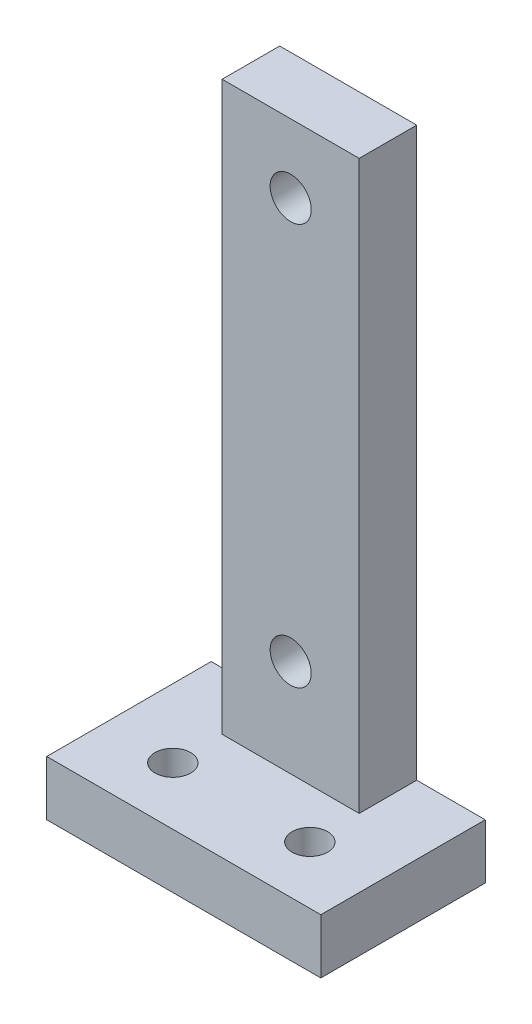
ISO-10303-21;
HEADER;
FILE_DESCRIPTION(('STEP AP214'),'2;1');
FILE_NAME('part.step','',(''),(''),'','','');
FILE_SCHEMA(('AUTOMOTIVE_DESIGN { 1 0 10303 214 1 1 1 1 }'));
ENDSEC;
DATA;
#1=APPLICATION_CONTEXT('core data for automotive mechanical design processes');
#2=APPLICATION_PROTOCOL_DEFINITION('international standard','automotive_design',2000,#1);
#3=PRODUCT_CONTEXT('',#1,'mechanical');
#4=PRODUCT('Part','Part','',(#3));
#5=PRODUCT_RELATED_PRODUCT_CATEGORY('part','',(#4));
#6=PRODUCT_DEFINITION_FORMATION('','',#4);
#7=PRODUCT_DEFINITION_CONTEXT('part definition',#1,'design');
#8=PRODUCT_DEFINITION('design','',#6,#7);
#9=PRODUCT_DEFINITION_SHAPE('','',#8);
#10=(LENGTH_UNIT() NAMED_UNIT(*) SI_UNIT(.MILLI.,.METRE.));
#11=(NAMED_UNIT(*) PLANE_ANGLE_UNIT() SI_UNIT($,.RADIAN.));
#12=(NAMED_UNIT(*) SI_UNIT($,.STERADIAN.) SOLID_ANGLE_UNIT());
#13=UNCERTAINTY_MEASURE_WITH_UNIT(LENGTH_MEASURE(1.E-05),#10,'distance_accuracy_value','');
#14=(GEOMETRIC_REPRESENTATION_CONTEXT(3) GLOBAL_UNCERTAINTY_ASSIGNED_CONTEXT((#13)) GLOBAL_UNIT_ASSIGNED_CONTEXT((#10,
#11,#12)) REPRESENTATION_CONTEXT('',''));
#15=CARTESIAN_POINT('',(0.,0.,0.));
#16=DIRECTION('',(0.,0.,1.));
#17=DIRECTION('',(1.,0.,0.));
#18=AXIS2_PLACEMENT_3D('',#15,#16,#17);
#19=CARTESIAN_POINT('',(-100.96160810836,-5.08,-61.813229454098));
#20=DIRECTION('',(-1.,0.,0.));
#21=DIRECTION('',(0.,0.,1.));
#22=AXIS2_PLACEMENT_3D('',#19,#20,#21);
#23=PLANE('',#22);
#24=DIRECTION('',(0.,0.,1.));
#25=VECTOR('',#24,1.);
#26=CARTESIAN_POINT('',(-100.96160810836,0.,-61.813229454098));
#27=LINE('',#26,#25);
#28=CARTESIAN_POINT('',(-100.96160810836,0.,-61.813229454098));
#29=VERTEX_POINT('',#28);
#30=CARTESIAN_POINT('',(-100.96160810836,0.,-46.573229454098));
#31=VERTEX_POINT('',#30);
#32=EDGE_CURVE('E134',#29,#31,#27,.T.);
#33=ORIENTED_EDGE('',*,*,#32,.F.);
#34=DIRECTION('',(0.,1.,0.));
#35=VECTOR('',#34,1.);
#36=CARTESIAN_POINT('',(-100.96160810836,-5.08,-61.813229454098));
#37=LINE('',#36,#35);
#38=CARTESIAN_POINT('',(-100.96160810836,-5.08,-61.813229454098));
#39=VERTEX_POINT('',#38);
#40=EDGE_CURVE('E11',#39,#29,#37,.T.);
#41=ORIENTED_EDGE('',*,*,#40,.F.);
#42=DIRECTION('',(0.,0.,1.));
#43=VECTOR('',#42,1.);
#44=CARTESIAN_POINT('',(-100.96160810836,-5.08,-61.813229454098));
#45=LINE('',#44,#43);
#46=CARTESIAN_POINT('',(-100.96160810836,-5.08,-46.573229454098));
#47=VERTEX_POINT('',#46);
#48=EDGE_CURVE('E137',#39,#47,#45,.T.);
#49=ORIENTED_EDGE('',*,*,#48,.T.);
#50=DIRECTION('',(0.,1.,0.));
#51=VECTOR('',#50,1.);
#52=CARTESIAN_POINT('',(-100.96160810836,-5.08,-46.573229454098));
#53=LINE('',#52,#51);
#54=EDGE_CURVE('E150',#47,#31,#53,.T.);
#55=ORIENTED_EDGE('',*,*,#54,.T.);
#56=EDGE_LOOP('',(#33,#41,#49,#55));
#57=FACE_BOUND('',#56,.T.);
#58=ADVANCED_FACE('F33',(#57),#23,.T.);
#59=CARTESIAN_POINT('',(-100.96160810836,-5.08,-61.813229454098));
#60=DIRECTION('',(0.,0.,-1.));
#61=DIRECTION('',(-1.,0.,0.));
#62=AXIS2_PLACEMENT_3D('',#59,#60,#61);
#63=PLANE('',#62);
#64=CARTESIAN_POINT('',(-88.26160810836,9.017,-61.813229454098));
#65=DIRECTION('',(0.,0.,-1.));
#66=DIRECTION('',(-1.,0.,0.));
#67=AXIS2_PLACEMENT_3D('',#64,#65,#66);
#68=CIRCLE('',#67,1.90500000000001);
#69=CARTESIAN_POINT('',(-90.16660810836,9.017,-61.813229454098));
#70=VERTEX_POINT('',#69);
#71=EDGE_CURVE('E200',#70,#70,#68,.T.);
#72=ORIENTED_EDGE('',*,*,#71,.F.);
#73=EDGE_LOOP('',(#72));
#74=FACE_BOUND('',#73,.T.);
#75=CARTESIAN_POINT('',(-88.26160810836,46.228,-61.813229454098));
#76=DIRECTION('',(0.,0.,-1.));
#77=DIRECTION('',(-1.,0.,0.));
#78=AXIS2_PLACEMENT_3D('',#75,#76,#77);
#79=CIRCLE('',#78,1.90500000000001);
#80=CARTESIAN_POINT('',(-90.16660810836,46.228,-61.813229454098));
#81=VERTEX_POINT('',#80);
#82=EDGE_CURVE('E194',#81,#81,#79,.T.);
#83=ORIENTED_EDGE('',*,*,#82,.F.);
#84=EDGE_LOOP('',(#83));
#85=FACE_BOUND('',#84,.T.);
#86=DIRECTION('',(-1.,0.,0.));
#87=VECTOR('',#86,1.);
#88=CARTESIAN_POINT('',(-100.96160810836,0.,-61.813229454098));
#89=LINE('',#88,#87);
#90=CARTESIAN_POINT('',(-75.56160810836,0.,-61.813229454098));
#91=VERTEX_POINT('',#90);
#92=CARTESIAN_POINT('',(-81.91160810836,0.,-61.813229454098));
#93=VERTEX_POINT('',#92);
#94=EDGE_CURVE('E141',#91,#93,#89,.T.);
#95=ORIENTED_EDGE('',*,*,#94,.F.);
#96=DIRECTION('',(0.,1.,0.));
#97=VECTOR('',#96,1.);
#98=CARTESIAN_POINT('',(-75.56160810836,-5.08,-61.813229454098));
#99=LINE('',#98,#97);
#100=CARTESIAN_POINT('',(-75.56160810836,-5.08,-61.813229454098));
#101=VERTEX_POINT('',#100);
#102=EDGE_CURVE('E41',#101,#91,#99,.T.);
#103=ORIENTED_EDGE('',*,*,#102,.F.);
#104=DIRECTION('',(-1.,0.,0.));
#105=VECTOR('',#104,1.);
#106=CARTESIAN_POINT('',(-100.96160810836,-5.08,-61.813229454098));
#107=LINE('',#106,#105);
#108=EDGE_CURVE('E147',#101,#39,#107,.T.);
#109=ORIENTED_EDGE('',*,*,#108,.T.);
#110=ORIENTED_EDGE('',*,*,#40,.T.);
#111=CARTESIAN_POINT('',(-94.61160810836,0.,-61.813229454098));
#112=VERTEX_POINT('',#111);
#113=EDGE_CURVE('E159',#112,#29,#89,.T.);
#114=ORIENTED_EDGE('',*,*,#113,.F.);
#115=DIRECTION('',(0.,-1.,0.));
#116=VECTOR('',#115,1.);
#117=CARTESIAN_POINT('',(-94.61160810836,52.578,-61.813229454098));
#118=LINE('',#117,#116);
#119=CARTESIAN_POINT('',(-94.61160810836,52.578,-61.813229454098));
#120=VERTEX_POINT('',#119);
#121=EDGE_CURVE('E184',#120,#112,#118,.T.);
#122=ORIENTED_EDGE('',*,*,#121,.F.);
#123=DIRECTION('',(-1.,0.,0.));
#124=VECTOR('',#123,1.);
#125=CARTESIAN_POINT('',(-94.61160810836,52.578,-61.813229454098));
#126=LINE('',#125,#124);
#127=CARTESIAN_POINT('',(-81.91160810836,52.578,-61.813229454098));
#128=VERTEX_POINT('',#127);
#129=EDGE_CURVE('E112',#128,#120,#126,.T.);
#130=ORIENTED_EDGE('',*,*,#129,.F.);
#131=DIRECTION('',(0.,-1.,0.));
#132=VECTOR('',#131,1.);
#133=CARTESIAN_POINT('',(-81.91160810836,52.578,-61.813229454098));
#134=LINE('',#133,#132);
#135=EDGE_CURVE('E124',#128,#93,#134,.T.);
#136=ORIENTED_EDGE('',*,*,#135,.T.);
#137=EDGE_LOOP('',(#95,#103,#109,#110,#114,#122,#130,#136));
#138=FACE_BOUND('',#137,.T.);
#139=ADVANCED_FACE('F181',(#74,#85,#138),#63,.T.);
#140=CARTESIAN_POINT('',(-75.56160810836,-5.08,-61.813229454098));
#141=DIRECTION('',(1.,0.,0.));
#142=DIRECTION('',(0.,0.,-1.));
#143=AXIS2_PLACEMENT_3D('',#140,#141,#142);
#144=PLANE('',#143);
#145=DIRECTION('',(0.,0.,-1.));
#146=VECTOR('',#145,1.);
#147=CARTESIAN_POINT('',(-75.56160810836,0.,-61.813229454098));
#148=LINE('',#147,#146);
#149=CARTESIAN_POINT('',(-75.56160810836,0.,-46.573229454098));
#150=VERTEX_POINT('',#149);
#151=EDGE_CURVE('E156',#150,#91,#148,.T.);
#152=ORIENTED_EDGE('',*,*,#151,.F.);
#153=DIRECTION('',(0.,1.,0.));
#154=VECTOR('',#153,1.);
#155=CARTESIAN_POINT('',(-75.56160810836,-5.08,-46.573229454098));
#156=LINE('',#155,#154);
#157=CARTESIAN_POINT('',(-75.56160810836,-5.08,-46.573229454098));
#158=VERTEX_POINT('',#157);
#159=EDGE_CURVE('E168',#158,#150,#156,.T.);
#160=ORIENTED_EDGE('',*,*,#159,.F.);
#161=DIRECTION('',(0.,0.,-1.));
#162=VECTOR('',#161,1.);
#163=CARTESIAN_POINT('',(-75.56160810836,-5.08,-61.813229454098));
#164=LINE('',#163,#162);
#165=EDGE_CURVE('E144',#158,#101,#164,.T.);
#166=ORIENTED_EDGE('',*,*,#165,.T.);
#167=ORIENTED_EDGE('',*,*,#102,.T.);
#168=EDGE_LOOP('',(#152,#160,#166,#167));
#169=FACE_BOUND('',#168,.T.);
#170=ADVANCED_FACE('F171',(#169),#144,.T.);
#171=CARTESIAN_POINT('',(-100.96160810836,-5.08,-46.573229454098));
#172=DIRECTION('',(0.,0.,1.));
#173=DIRECTION('',(1.,0.,0.));
#174=AXIS2_PLACEMENT_3D('',#171,#172,#173);
#175=PLANE('',#174);
#176=DIRECTION('',(1.,0.,0.));
#177=VECTOR('',#176,1.);
#178=CARTESIAN_POINT('',(-100.96160810836,0.,-46.573229454098));
#179=LINE('',#178,#177);
#180=EDGE_CURVE('E153',#31,#150,#179,.T.);
#181=ORIENTED_EDGE('',*,*,#180,.F.);
#182=ORIENTED_EDGE('',*,*,#54,.F.);
#183=DIRECTION('',(1.,0.,0.));
#184=VECTOR('',#183,1.);
#185=CARTESIAN_POINT('',(-100.96160810836,-5.08,-46.573229454098));
#186=LINE('',#185,#184);
#187=EDGE_CURVE('E140',#47,#158,#186,.T.);
#188=ORIENTED_EDGE('',*,*,#187,.T.);
#189=ORIENTED_EDGE('',*,*,#159,.T.);
#190=EDGE_LOOP('',(#181,#182,#188,#189));
#191=FACE_BOUND('',#190,.T.);
#192=ADVANCED_FACE('F239',(#191),#175,.T.);
#193=CARTESIAN_POINT('',(0.,-5.08,0.));
#194=DIRECTION('',(0.,1.,0.));
#195=DIRECTION('',(0.,0.,1.));
#196=AXIS2_PLACEMENT_3D('',#193,#194,#195);
#197=PLANE('',#196);
#198=CARTESIAN_POINT('',(-81.91160810836,-5.08,-51.907229454098));
#199=DIRECTION('',(0.,1.,0.));
#200=DIRECTION('',(0.,0.,1.));
#201=AXIS2_PLACEMENT_3D('',#198,#199,#200);
#202=CIRCLE('',#201,1.65100000000001);
#203=CARTESIAN_POINT('',(-81.91160810836,-5.08,-50.256229454098));
#204=VERTEX_POINT('',#203);
#205=EDGE_CURVE('E122',#204,#204,#202,.T.);
#206=ORIENTED_EDGE('',*,*,#205,.T.);
#207=EDGE_LOOP('',(#206));
#208=FACE_BOUND('',#207,.T.);
#209=CARTESIAN_POINT('',(-94.61160810836,-5.08,-51.907229454098));
#210=DIRECTION('',(0.,1.,0.));
#211=DIRECTION('',(0.,0.,1.));
#212=AXIS2_PLACEMENT_3D('',#209,#210,#211);
#213=CIRCLE('',#212,1.65100000000001);
#214=CARTESIAN_POINT('',(-94.61160810836,-5.08,-50.256229454098));
#215=VERTEX_POINT('',#214);
#216=EDGE_CURVE('E131',#215,#215,#213,.T.);
#217=ORIENTED_EDGE('',*,*,#216,.T.);
#218=EDGE_LOOP('',(#217));
#219=FACE_BOUND('',#218,.T.);
#220=ORIENTED_EDGE('',*,*,#48,.F.);
#221=ORIENTED_EDGE('',*,*,#108,.F.);
#222=ORIENTED_EDGE('',*,*,#165,.F.);
#223=ORIENTED_EDGE('',*,*,#187,.F.);
#224=EDGE_LOOP('',(#220,#221,#222,#223));
#225=FACE_BOUND('',#224,.T.);
#226=ADVANCED_FACE('F236',(#208,#219,#225),#197,.F.);
#227=CARTESIAN_POINT('',(0.,0.,0.));
#228=DIRECTION('',(0.,1.,0.));
#229=DIRECTION('',(0.,0.,1.));
#230=AXIS2_PLACEMENT_3D('',#227,#228,#229);
#231=PLANE('',#230);
#232=DIRECTION('',(0.,0.,1.));
#233=VECTOR('',#232,1.);
#234=CARTESIAN_POINT('',(-94.61160810836,0.,-61.813229454098));
#235=LINE('',#234,#233);
#236=CARTESIAN_POINT('',(-94.61160810836,0.,-56.479229454098));
#237=VERTEX_POINT('',#236);
#238=EDGE_CURVE('E54',#112,#237,#235,.T.);
#239=ORIENTED_EDGE('',*,*,#238,.F.);
#240=ORIENTED_EDGE('',*,*,#113,.T.);
#241=ORIENTED_EDGE('',*,*,#32,.T.);
#242=ORIENTED_EDGE('',*,*,#180,.T.);
#243=ORIENTED_EDGE('',*,*,#151,.T.);
#244=ORIENTED_EDGE('',*,*,#94,.T.);
#245=DIRECTION('',(0.,0.,-1.));
#246=VECTOR('',#245,1.);
#247=CARTESIAN_POINT('',(-81.91160810836,0.,-61.813229454098));
#248=LINE('',#247,#246);
#249=CARTESIAN_POINT('',(-81.91160810836,0.,-56.479229454098));
#250=VERTEX_POINT('',#249);
#251=EDGE_CURVE('E116',#250,#93,#248,.T.);
#252=ORIENTED_EDGE('',*,*,#251,.F.);
#253=DIRECTION('',(1.,0.,0.));
#254=VECTOR('',#253,1.);
#255=CARTESIAN_POINT('',(-94.61160810836,0.,-56.479229454098));
#256=LINE('',#255,#254);
#257=EDGE_CURVE('E49',#237,#250,#256,.T.);
#258=ORIENTED_EDGE('',*,*,#257,.F.);
#259=EDGE_LOOP('',(#239,#240,#241,#242,#243,#244,#252,#258));
#260=FACE_BOUND('',#259,.T.);
#261=CARTESIAN_POINT('',(-81.91160810836,0.,-51.907229454098));
#262=DIRECTION('',(0.,1.,0.));
#263=DIRECTION('',(0.,0.,1.));
#264=AXIS2_PLACEMENT_3D('',#261,#262,#263);
#265=CIRCLE('',#264,1.65100000000001);
#266=CARTESIAN_POINT('',(-81.91160810836,0.,-50.256229454098));
#267=VERTEX_POINT('',#266);
#268=EDGE_CURVE('E119',#267,#267,#265,.T.);
#269=ORIENTED_EDGE('',*,*,#268,.F.);
#270=EDGE_LOOP('',(#269));
#271=FACE_BOUND('',#270,.T.);
#272=CARTESIAN_POINT('',(-94.61160810836,0.,-51.907229454098));
#273=DIRECTION('',(0.,1.,0.));
#274=DIRECTION('',(0.,0.,1.));
#275=AXIS2_PLACEMENT_3D('',#272,#273,#274);
#276=CIRCLE('',#275,1.65100000000001);
#277=CARTESIAN_POINT('',(-94.61160810836,0.,-50.256229454098));
#278=VERTEX_POINT('',#277);
#279=EDGE_CURVE('E129',#278,#278,#276,.T.);
#280=ORIENTED_EDGE('',*,*,#279,.F.);
#281=EDGE_LOOP('',(#280));
#282=FACE_BOUND('',#281,.T.);
#283=ADVANCED_FACE('F176',(#260,#271,#282),#231,.T.);
#284=CARTESIAN_POINT('',(-94.61160810836,-5.08,-51.907229454098));
#285=DIRECTION('',(0.,1.,0.));
#286=DIRECTION('',(0.,0.,1.));
#287=AXIS2_PLACEMENT_3D('',#284,#285,#286);
#288=CYLINDRICAL_SURFACE('',#287,1.65100000000001);
#289=ORIENTED_EDGE('',*,*,#216,.F.);
#290=EDGE_LOOP('',(#289));
#291=FACE_BOUND('',#290,.T.);
#292=ORIENTED_EDGE('',*,*,#279,.T.);
#293=EDGE_LOOP('',(#292));
#294=FACE_BOUND('',#293,.T.);
#295=ADVANCED_FACE('F250',(#291,#294),#288,.F.);
#296=CARTESIAN_POINT('',(-81.91160810836,-5.08,-51.907229454098));
#297=DIRECTION('',(0.,1.,0.));
#298=DIRECTION('',(0.,0.,1.));
#299=AXIS2_PLACEMENT_3D('',#296,#297,#298);
#300=CYLINDRICAL_SURFACE('',#299,1.65100000000001);
#301=ORIENTED_EDGE('',*,*,#205,.F.);
#302=EDGE_LOOP('',(#301));
#303=FACE_BOUND('',#302,.T.);
#304=ORIENTED_EDGE('',*,*,#268,.T.);
#305=EDGE_LOOP('',(#304));
#306=FACE_BOUND('',#305,.T.);
#307=ADVANCED_FACE('F254',(#303,#306),#300,.F.);
#308=CARTESIAN_POINT('',(-94.61160810836,52.578,-61.813229454098));
#309=DIRECTION('',(1.,0.,0.));
#310=DIRECTION('',(0.,0.,-1.));
#311=AXIS2_PLACEMENT_3D('',#308,#309,#310);
#312=PLANE('',#311);
#313=ORIENTED_EDGE('',*,*,#238,.T.);
#314=DIRECTION('',(0.,-1.,0.));
#315=VECTOR('',#314,1.);
#316=CARTESIAN_POINT('',(-94.61160810836,52.578,-56.479229454098));
#317=LINE('',#316,#315);
#318=CARTESIAN_POINT('',(-94.61160810836,52.578,-56.479229454098));
#319=VERTEX_POINT('',#318);
#320=EDGE_CURVE('E101',#319,#237,#317,.T.);
#321=ORIENTED_EDGE('',*,*,#320,.F.);
#322=DIRECTION('',(0.,0.,1.));
#323=VECTOR('',#322,1.);
#324=CARTESIAN_POINT('',(-94.61160810836,52.578,-61.813229454098));
#325=LINE('',#324,#323);
#326=EDGE_CURVE('E107',#120,#319,#325,.T.);
#327=ORIENTED_EDGE('',*,*,#326,.F.);
#328=ORIENTED_EDGE('',*,*,#121,.T.);
#329=EDGE_LOOP('',(#313,#321,#327,#328));
#330=FACE_BOUND('',#329,.T.);
#331=ADVANCED_FACE('F118',(#330),#312,.F.);
#332=CARTESIAN_POINT('',(-94.61160810836,52.578,-56.479229454098));
#333=DIRECTION('',(0.,0.,-1.));
#334=DIRECTION('',(-1.,0.,0.));
#335=AXIS2_PLACEMENT_3D('',#332,#333,#334);
#336=PLANE('',#335);
#337=CARTESIAN_POINT('',(-88.26160810836,9.017,-56.479229454098));
#338=DIRECTION('',(0.,0.,1.));
#339=DIRECTION('',(1.,0.,0.));
#340=AXIS2_PLACEMENT_3D('',#337,#338,#339);
#341=CIRCLE('',#340,1.90500000000001);
#342=CARTESIAN_POINT('',(-86.35660810836,9.017,-56.479229454098));
#343=VERTEX_POINT('',#342);
#344=EDGE_CURVE('E203',#343,#343,#341,.T.);
#345=ORIENTED_EDGE('',*,*,#344,.F.);
#346=EDGE_LOOP('',(#345));
#347=FACE_BOUND('',#346,.T.);
#348=CARTESIAN_POINT('',(-88.26160810836,46.228,-56.479229454098));
#349=DIRECTION('',(0.,0.,1.));
#350=DIRECTION('',(1.,0.,0.));
#351=AXIS2_PLACEMENT_3D('',#348,#349,#350);
#352=CIRCLE('',#351,1.90500000000001);
#353=CARTESIAN_POINT('',(-86.35660810836,46.228,-56.479229454098));
#354=VERTEX_POINT('',#353);
#355=EDGE_CURVE('E197',#354,#354,#352,.T.);
#356=ORIENTED_EDGE('',*,*,#355,.F.);
#357=EDGE_LOOP('',(#356));
#358=FACE_BOUND('',#357,.T.);
#359=ORIENTED_EDGE('',*,*,#257,.T.);
#360=DIRECTION('',(0.,-1.,0.));
#361=VECTOR('',#360,1.);
#362=CARTESIAN_POINT('',(-81.91160810836,52.578,-56.479229454098));
#363=LINE('',#362,#361);
#364=CARTESIAN_POINT('',(-81.91160810836,52.578,-56.479229454098));
#365=VERTEX_POINT('',#364);
#366=EDGE_CURVE('E103',#365,#250,#363,.T.);
#367=ORIENTED_EDGE('',*,*,#366,.F.);
#368=DIRECTION('',(1.,0.,0.));
#369=VECTOR('',#368,1.);
#370=CARTESIAN_POINT('',(-94.61160810836,52.578,-56.479229454098));
#371=LINE('',#370,#369);
#372=EDGE_CURVE('E97',#319,#365,#371,.T.);
#373=ORIENTED_EDGE('',*,*,#372,.F.);
#374=ORIENTED_EDGE('',*,*,#320,.T.);
#375=EDGE_LOOP('',(#359,#367,#373,#374));
#376=FACE_BOUND('',#375,.T.);
#377=ADVANCED_FACE('F99',(#347,#358,#376),#336,.F.);
#378=CARTESIAN_POINT('',(-81.91160810836,52.578,-61.813229454098));
#379=DIRECTION('',(-1.,0.,0.));
#380=DIRECTION('',(0.,0.,1.));
#381=AXIS2_PLACEMENT_3D('',#378,#379,#380);
#382=PLANE('',#381);
#383=ORIENTED_EDGE('',*,*,#251,.T.);
#384=ORIENTED_EDGE('',*,*,#135,.F.);
#385=DIRECTION('',(0.,0.,-1.));
#386=VECTOR('',#385,1.);
#387=CARTESIAN_POINT('',(-81.91160810836,52.578,-61.813229454098));
#388=LINE('',#387,#386);
#389=EDGE_CURVE('E106',#365,#128,#388,.T.);
#390=ORIENTED_EDGE('',*,*,#389,.F.);
#391=ORIENTED_EDGE('',*,*,#366,.T.);
#392=EDGE_LOOP('',(#383,#384,#390,#391));
#393=FACE_BOUND('',#392,.T.);
#394=ADVANCED_FACE('F211',(#393),#382,.F.);
#395=CARTESIAN_POINT('',(0.,52.578,0.));
#396=DIRECTION('',(0.,1.,0.));
#397=DIRECTION('',(0.,0.,1.));
#398=AXIS2_PLACEMENT_3D('',#395,#396,#397);
#399=PLANE('',#398);
#400=ORIENTED_EDGE('',*,*,#326,.T.);
#401=ORIENTED_EDGE('',*,*,#372,.T.);
#402=ORIENTED_EDGE('',*,*,#389,.T.);
#403=ORIENTED_EDGE('',*,*,#129,.T.);
#404=EDGE_LOOP('',(#400,#401,#402,#403));
#405=FACE_BOUND('',#404,.T.);
#406=ADVANCED_FACE('F110',(#405),#399,.T.);
#407=CARTESIAN_POINT('',(-88.26160810836,46.228,-61.813279454098));
#408=DIRECTION('',(0.,0.,1.));
#409=DIRECTION('',(1.,0.,0.));
#410=AXIS2_PLACEMENT_3D('',#407,#408,#409);
#411=CYLINDRICAL_SURFACE('',#410,1.90500000000001);
#412=ORIENTED_EDGE('',*,*,#82,.T.);
#413=EDGE_LOOP('',(#412));
#414=FACE_BOUND('',#413,.T.);
#415=ORIENTED_EDGE('',*,*,#355,.T.);
#416=EDGE_LOOP('',(#415));
#417=FACE_BOUND('',#416,.T.);
#418=ADVANCED_FACE('F215',(#414,#417),#411,.F.);
#419=CARTESIAN_POINT('',(-88.26160810836,9.017,-61.813279454098));
#420=DIRECTION('',(0.,0.,1.));
#421=DIRECTION('',(1.,0.,0.));
#422=AXIS2_PLACEMENT_3D('',#419,#420,#421);
#423=CYLINDRICAL_SURFACE('',#422,1.90500000000001);
#424=ORIENTED_EDGE('',*,*,#71,.T.);
#425=EDGE_LOOP('',(#424));
#426=FACE_BOUND('',#425,.T.);
#427=ORIENTED_EDGE('',*,*,#344,.T.);
#428=EDGE_LOOP('',(#427));
#429=FACE_BOUND('',#428,.T.);
#430=ADVANCED_FACE('F207',(#426,#429),#423,.F.);
#431=CLOSED_SHELL('',(#58,#139,#170,#192,#226,#283,#295,#307,#331,#377,#394,#406,#418,#430));
#432=MANIFOLD_SOLID_BREP('B2',#431);
#433=ADVANCED_BREP_SHAPE_REPRESENTATION('',(#18,#432),#14);
#434=SHAPE_DEFINITION_REPRESENTATION(#9,#433);
ENDSEC;
END-ISO-10303-21;
